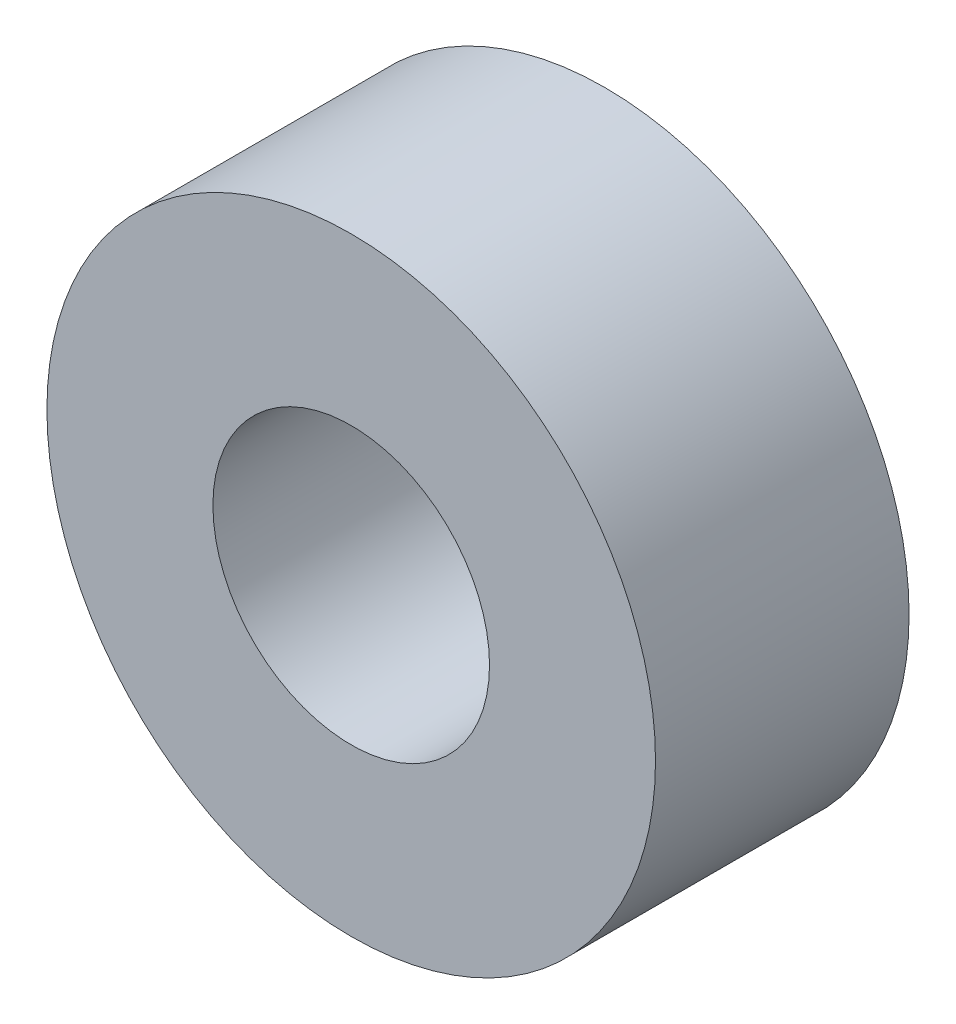
ISO-10303-21;
HEADER;
FILE_DESCRIPTION(('STEP AP214'),'2;1');
FILE_NAME('part.step','',(''),(''),'','','');
FILE_SCHEMA(('AUTOMOTIVE_DESIGN { 1 0 10303 214 1 1 1 1 }'));
ENDSEC;
DATA;
#1=APPLICATION_CONTEXT('core data for automotive mechanical design processes');
#2=APPLICATION_PROTOCOL_DEFINITION('international standard','automotive_design',2000,#1);
#3=PRODUCT_CONTEXT('',#1,'mechanical');
#4=PRODUCT('Part','Part','',(#3));
#5=PRODUCT_RELATED_PRODUCT_CATEGORY('part','',(#4));
#6=PRODUCT_DEFINITION_FORMATION('','',#4);
#7=PRODUCT_DEFINITION_CONTEXT('part definition',#1,'design');
#8=PRODUCT_DEFINITION('design','',#6,#7);
#9=PRODUCT_DEFINITION_SHAPE('','',#8);
#10=(LENGTH_UNIT() NAMED_UNIT(*) SI_UNIT(.MILLI.,.METRE.));
#11=(NAMED_UNIT(*) PLANE_ANGLE_UNIT() SI_UNIT($,.RADIAN.));
#12=(NAMED_UNIT(*) SI_UNIT($,.STERADIAN.) SOLID_ANGLE_UNIT());
#13=UNCERTAINTY_MEASURE_WITH_UNIT(LENGTH_MEASURE(1.E-05),#10,'distance_accuracy_value','');
#14=(GEOMETRIC_REPRESENTATION_CONTEXT(3) GLOBAL_UNCERTAINTY_ASSIGNED_CONTEXT((#13)) GLOBAL_UNIT_ASSIGNED_CONTEXT((#10,
#11,#12)) REPRESENTATION_CONTEXT('',''));
#15=CARTESIAN_POINT('',(0.,0.,0.));
#16=DIRECTION('',(0.,0.,1.));
#17=DIRECTION('',(1.,0.,0.));
#18=AXIS2_PLACEMENT_3D('',#15,#16,#17);
#19=CARTESIAN_POINT('',(0.,0.,1.375));
#20=DIRECTION('',(0.,0.,1.));
#21=DIRECTION('',(1.,0.,0.));
#22=AXIS2_PLACEMENT_3D('',#19,#20,#21);
#23=PLANE('',#22);
#24=CARTESIAN_POINT('',(0.,0.,1.375));
#25=DIRECTION('',(0.,0.,1.));
#26=DIRECTION('',(1.,0.,0.));
#27=AXIS2_PLACEMENT_3D('',#24,#25,#26);
#28=CIRCLE('',#27,3.3);
#29=CARTESIAN_POINT('',(3.3,0.,1.375));
#30=VERTEX_POINT('',#29);
#31=EDGE_CURVE('E10',#30,#30,#28,.T.);
#32=ORIENTED_EDGE('',*,*,#31,.T.);
#33=EDGE_LOOP('',(#32));
#34=FACE_BOUND('',#33,.T.);
#35=CARTESIAN_POINT('',(0.,0.,1.375));
#36=DIRECTION('',(0.,0.,1.));
#37=DIRECTION('',(1.,0.,0.));
#38=AXIS2_PLACEMENT_3D('',#35,#36,#37);
#39=CIRCLE('',#38,1.5);
#40=CARTESIAN_POINT('',(1.5,0.,1.375));
#41=VERTEX_POINT('',#40);
#42=EDGE_CURVE('E47',#41,#41,#39,.T.);
#43=ORIENTED_EDGE('',*,*,#42,.F.);
#44=EDGE_LOOP('',(#43));
#45=FACE_BOUND('',#44,.T.);
#46=ADVANCED_FACE('F36',(#34,#45),#23,.T.);
#47=CARTESIAN_POINT('',(0.,0.,-1.375));
#48=DIRECTION('',(0.,0.,1.));
#49=DIRECTION('',(1.,0.,0.));
#50=AXIS2_PLACEMENT_3D('',#47,#48,#49);
#51=PLANE('',#50);
#52=CARTESIAN_POINT('',(0.,0.,-1.375));
#53=DIRECTION('',(0.,0.,1.));
#54=DIRECTION('',(1.,0.,0.));
#55=AXIS2_PLACEMENT_3D('',#52,#53,#54);
#56=CIRCLE('',#55,3.3);
#57=CARTESIAN_POINT('',(3.3,0.,-1.375));
#58=VERTEX_POINT('',#57);
#59=EDGE_CURVE('E40',#58,#58,#56,.T.);
#60=ORIENTED_EDGE('',*,*,#59,.F.);
#61=EDGE_LOOP('',(#60));
#62=FACE_BOUND('',#61,.T.);
#63=CARTESIAN_POINT('',(0.,0.,-1.375));
#64=DIRECTION('',(0.,0.,1.));
#65=DIRECTION('',(1.,0.,0.));
#66=AXIS2_PLACEMENT_3D('',#63,#64,#65);
#67=CIRCLE('',#66,1.5);
#68=CARTESIAN_POINT('',(1.5,0.,-1.375));
#69=VERTEX_POINT('',#68);
#70=EDGE_CURVE('E49',#69,#69,#67,.T.);
#71=ORIENTED_EDGE('',*,*,#70,.T.);
#72=EDGE_LOOP('',(#71));
#73=FACE_BOUND('',#72,.T.);
#74=ADVANCED_FACE('F59',(#62,#73),#51,.F.);
#75=CARTESIAN_POINT('',(0.,0.,1.375));
#76=DIRECTION('',(0.,0.,-1.));
#77=DIRECTION('',(-1.,0.,0.));
#78=AXIS2_PLACEMENT_3D('',#75,#76,#77);
#79=CYLINDRICAL_SURFACE('',#78,3.3);
#80=ORIENTED_EDGE('',*,*,#31,.F.);
#81=EDGE_LOOP('',(#80));
#82=FACE_BOUND('',#81,.T.);
#83=ORIENTED_EDGE('',*,*,#59,.T.);
#84=EDGE_LOOP('',(#83));
#85=FACE_BOUND('',#84,.T.);
#86=ADVANCED_FACE('F38',(#82,#85),#79,.T.);
#87=CARTESIAN_POINT('',(0.,0.,1.375));
#88=DIRECTION('',(0.,0.,-1.));
#89=DIRECTION('',(-1.,0.,0.));
#90=AXIS2_PLACEMENT_3D('',#87,#88,#89);
#91=CYLINDRICAL_SURFACE('',#90,1.5);
#92=ORIENTED_EDGE('',*,*,#42,.T.);
#93=EDGE_LOOP('',(#92));
#94=FACE_BOUND('',#93,.T.);
#95=ORIENTED_EDGE('',*,*,#70,.F.);
#96=EDGE_LOOP('',(#95));
#97=FACE_BOUND('',#96,.T.);
#98=ADVANCED_FACE('F55',(#94,#97),#91,.F.);
#99=CLOSED_SHELL('',(#46,#74,#86,#98));
#100=MANIFOLD_SOLID_BREP('B2',#99);
#101=ADVANCED_BREP_SHAPE_REPRESENTATION('',(#18,#100),#14);
#102=SHAPE_DEFINITION_REPRESENTATION(#9,#101);
ENDSEC;
END-ISO-10303-21;
